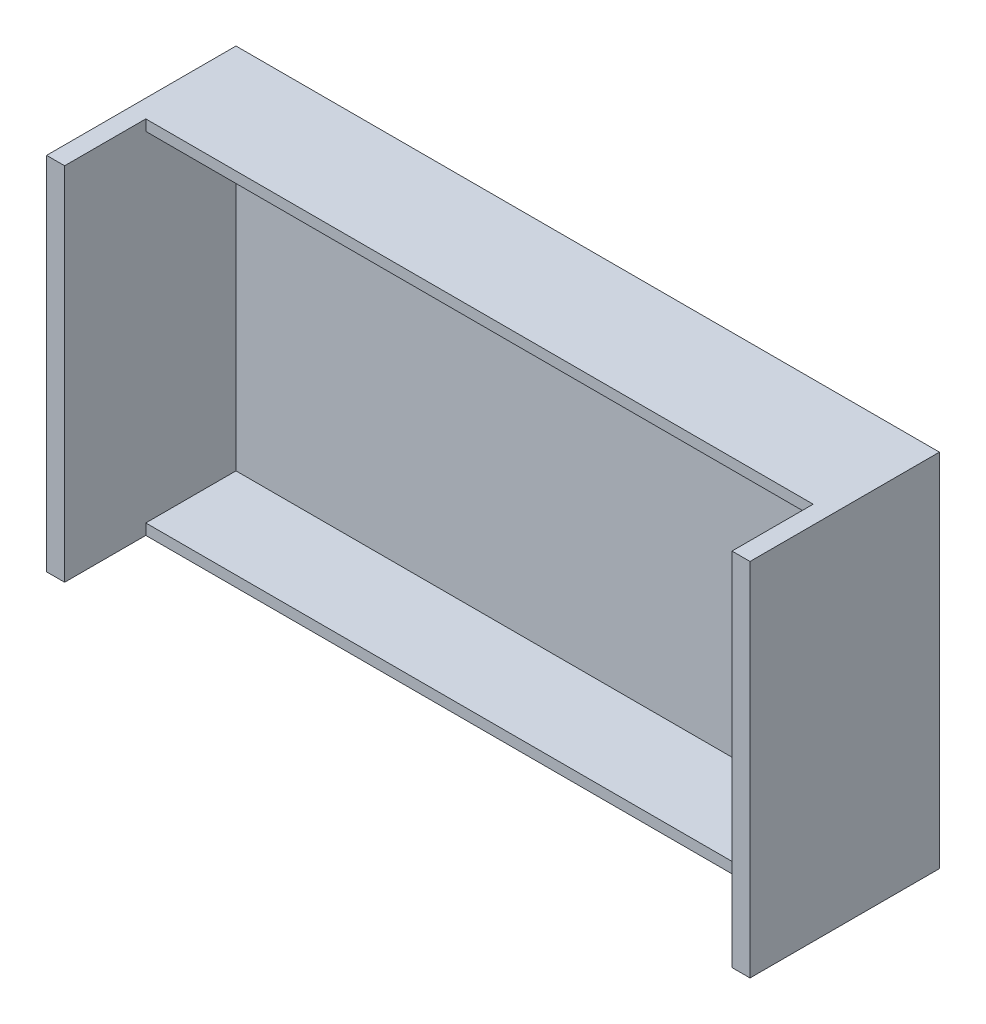
ISO-10303-21;
HEADER;
FILE_DESCRIPTION(('STEP AP214'),'2;1');
FILE_NAME('part.step','',(''),(''),'','','');
FILE_SCHEMA(('AUTOMOTIVE_DESIGN { 1 0 10303 214 1 1 1 1 }'));
ENDSEC;
DATA;
#1=APPLICATION_CONTEXT('core data for automotive mechanical design processes');
#2=APPLICATION_PROTOCOL_DEFINITION('international standard','automotive_design',2000,#1);
#3=PRODUCT_CONTEXT('',#1,'mechanical');
#4=PRODUCT('Part','Part','',(#3));
#5=PRODUCT_RELATED_PRODUCT_CATEGORY('part','',(#4));
#6=PRODUCT_DEFINITION_FORMATION('','',#4);
#7=PRODUCT_DEFINITION_CONTEXT('part definition',#1,'design');
#8=PRODUCT_DEFINITION('design','',#6,#7);
#9=PRODUCT_DEFINITION_SHAPE('','',#8);
#10=(LENGTH_UNIT() NAMED_UNIT(*) SI_UNIT(.MILLI.,.METRE.));
#11=(NAMED_UNIT(*) PLANE_ANGLE_UNIT() SI_UNIT($,.RADIAN.));
#12=(NAMED_UNIT(*) SI_UNIT($,.STERADIAN.) SOLID_ANGLE_UNIT());
#13=UNCERTAINTY_MEASURE_WITH_UNIT(LENGTH_MEASURE(1.E-05),#10,'distance_accuracy_value','');
#14=(GEOMETRIC_REPRESENTATION_CONTEXT(3) GLOBAL_UNCERTAINTY_ASSIGNED_CONTEXT((#13)) GLOBAL_UNIT_ASSIGNED_CONTEXT((#10,
#11,#12)) REPRESENTATION_CONTEXT('',''));
#15=CARTESIAN_POINT('',(0.,0.,0.));
#16=DIRECTION('',(0.,0.,1.));
#17=DIRECTION('',(1.,0.,0.));
#18=AXIS2_PLACEMENT_3D('',#15,#16,#17);
#19=CARTESIAN_POINT('',(0.,0.,5.));
#20=DIRECTION('',(0.,0.,-1.));
#21=DIRECTION('',(-1.,0.,0.));
#22=AXIS2_PLACEMENT_3D('',#19,#20,#21);
#23=PLANE('',#22);
#24=DIRECTION('',(1.,0.,0.));
#25=VECTOR('',#24,1.);
#26=CARTESIAN_POINT('',(0.,-21.2,5.));
#27=LINE('',#26,#25);
#28=CARTESIAN_POINT('',(-37.,-21.2,5.00000000000001));
#29=VERTEX_POINT('',#28);
#30=CARTESIAN_POINT('',(37.,-21.2,5.00000000000001));
#31=VERTEX_POINT('',#30);
#32=EDGE_CURVE('E243',#29,#31,#27,.T.);
#33=ORIENTED_EDGE('',*,*,#32,.F.);
#34=DIRECTION('',(0.,1.,0.));
#35=VECTOR('',#34,1.);
#36=CARTESIAN_POINT('',(-37.,0.,5.));
#37=LINE('',#36,#35);
#38=CARTESIAN_POINT('',(-37.,-58.8,5.));
#39=VERTEX_POINT('',#38);
#40=EDGE_CURVE('E176',#39,#29,#37,.T.);
#41=ORIENTED_EDGE('',*,*,#40,.F.);
#42=DIRECTION('',(-1.,0.,0.));
#43=VECTOR('',#42,1.);
#44=CARTESIAN_POINT('',(0.,-58.8,5.));
#45=LINE('',#44,#43);
#46=CARTESIAN_POINT('',(37.,-58.8,5.));
#47=VERTEX_POINT('',#46);
#48=EDGE_CURVE('E212',#47,#39,#45,.T.);
#49=ORIENTED_EDGE('',*,*,#48,.F.);
#50=DIRECTION('',(0.,-1.,0.));
#51=VECTOR('',#50,1.);
#52=CARTESIAN_POINT('',(37.,0.,5.));
#53=LINE('',#52,#51);
#54=EDGE_CURVE('E153',#31,#47,#53,.T.);
#55=ORIENTED_EDGE('',*,*,#54,.F.);
#56=EDGE_LOOP('',(#33,#41,#49,#55));
#57=FACE_BOUND('',#56,.T.);
#58=ADVANCED_FACE('F39',(#57),#23,.F.);
#59=CARTESIAN_POINT('',(-37.,-60.,24.));
#60=DIRECTION('',(-1.,0.,0.));
#61=DIRECTION('',(0.,0.,1.));
#62=AXIS2_PLACEMENT_3D('',#59,#60,#61);
#63=PLANE('',#62);
#64=DIRECTION('',(0.,0.,-1.));
#65=VECTOR('',#64,1.);
#66=CARTESIAN_POINT('',(-37.,-21.2,15.));
#67=LINE('',#66,#65);
#68=CARTESIAN_POINT('',(-37.,-21.2,15.));
#69=VERTEX_POINT('',#68);
#70=EDGE_CURVE('E246',#69,#29,#67,.T.);
#71=ORIENTED_EDGE('',*,*,#70,.F.);
#72=DIRECTION('',(0.,-1.,0.));
#73=VECTOR('',#72,1.);
#74=CARTESIAN_POINT('',(-37.,-21.2,15.));
#75=LINE('',#74,#73);
#76=CARTESIAN_POINT('',(-37.,-20.,15.));
#77=VERTEX_POINT('',#76);
#78=EDGE_CURVE('E139',#77,#69,#75,.T.);
#79=ORIENTED_EDGE('',*,*,#78,.F.);
#80=DIRECTION('',(0.,0.,-1.));
#81=VECTOR('',#80,1.);
#82=CARTESIAN_POINT('',(-37.,-20.,24.));
#83=LINE('',#82,#81);
#84=CARTESIAN_POINT('',(-37.,-20.,24.));
#85=VERTEX_POINT('',#84);
#86=EDGE_CURVE('E136',#85,#77,#83,.T.);
#87=ORIENTED_EDGE('',*,*,#86,.F.);
#88=DIRECTION('',(0.,1.,0.));
#89=VECTOR('',#88,1.);
#90=CARTESIAN_POINT('',(-37.,-60.,24.));
#91=LINE('',#90,#89);
#92=CARTESIAN_POINT('',(-37.,-60.,24.));
#93=VERTEX_POINT('',#92);
#94=EDGE_CURVE('E156',#93,#85,#91,.T.);
#95=ORIENTED_EDGE('',*,*,#94,.F.);
#96=DIRECTION('',(0.,0.,-1.));
#97=VECTOR('',#96,1.);
#98=CARTESIAN_POINT('',(-37.,-60.,24.));
#99=LINE('',#98,#97);
#100=CARTESIAN_POINT('',(-37.,-60.,15.));
#101=VERTEX_POINT('',#100);
#102=EDGE_CURVE('E173',#93,#101,#99,.T.);
#103=ORIENTED_EDGE('',*,*,#102,.T.);
#104=DIRECTION('',(0.,-1.,0.));
#105=VECTOR('',#104,1.);
#106=CARTESIAN_POINT('',(-37.,-60.,15.));
#107=LINE('',#106,#105);
#108=CARTESIAN_POINT('',(-37.,-58.8,15.));
#109=VERTEX_POINT('',#108);
#110=EDGE_CURVE('E54',#109,#101,#107,.T.);
#111=ORIENTED_EDGE('',*,*,#110,.F.);
#112=DIRECTION('',(0.,0.,-1.));
#113=VECTOR('',#112,1.);
#114=CARTESIAN_POINT('',(-37.,-58.8,15.));
#115=LINE('',#114,#113);
#116=EDGE_CURVE('E59',#109,#39,#115,.T.);
#117=ORIENTED_EDGE('',*,*,#116,.T.);
#118=ORIENTED_EDGE('',*,*,#40,.T.);
#119=EDGE_LOOP('',(#71,#79,#87,#95,#103,#111,#117,#118));
#120=FACE_BOUND('',#119,.T.);
#121=ADVANCED_FACE('F245',(#120),#63,.F.);
#122=CARTESIAN_POINT('',(37.,-60.,24.));
#123=DIRECTION('',(1.,0.,0.));
#124=DIRECTION('',(0.,0.,-1.));
#125=AXIS2_PLACEMENT_3D('',#122,#123,#124);
#126=PLANE('',#125);
#127=DIRECTION('',(0.,0.,-1.));
#128=VECTOR('',#127,1.);
#129=CARTESIAN_POINT('',(37.,-21.2,15.));
#130=LINE('',#129,#128);
#131=CARTESIAN_POINT('',(37.,-21.2,15.));
#132=VERTEX_POINT('',#131);
#133=EDGE_CURVE('E240',#132,#31,#130,.T.);
#134=ORIENTED_EDGE('',*,*,#133,.T.);
#135=ORIENTED_EDGE('',*,*,#54,.T.);
#136=DIRECTION('',(0.,0.,-1.));
#137=VECTOR('',#136,1.);
#138=CARTESIAN_POINT('',(37.,-58.8,15.));
#139=LINE('',#138,#137);
#140=CARTESIAN_POINT('',(37.,-58.8,15.));
#141=VERTEX_POINT('',#140);
#142=EDGE_CURVE('E216',#141,#47,#139,.T.);
#143=ORIENTED_EDGE('',*,*,#142,.F.);
#144=DIRECTION('',(0.,1.,0.));
#145=VECTOR('',#144,1.);
#146=CARTESIAN_POINT('',(37.,-60.,15.));
#147=LINE('',#146,#145);
#148=CARTESIAN_POINT('',(37.,-60.,15.));
#149=VERTEX_POINT('',#148);
#150=EDGE_CURVE('E228',#149,#141,#147,.T.);
#151=ORIENTED_EDGE('',*,*,#150,.F.);
#152=DIRECTION('',(0.,0.,-1.));
#153=VECTOR('',#152,1.);
#154=CARTESIAN_POINT('',(37.,-60.,24.));
#155=LINE('',#154,#153);
#156=CARTESIAN_POINT('',(37.,-60.,24.));
#157=VERTEX_POINT('',#156);
#158=EDGE_CURVE('E154',#157,#149,#155,.T.);
#159=ORIENTED_EDGE('',*,*,#158,.F.);
#160=DIRECTION('',(0.,-1.,0.));
#161=VECTOR('',#160,1.);
#162=CARTESIAN_POINT('',(37.,-60.,24.));
#163=LINE('',#162,#161);
#164=CARTESIAN_POINT('',(37.,-20.,24.));
#165=VERTEX_POINT('',#164);
#166=EDGE_CURVE('E152',#165,#157,#163,.T.);
#167=ORIENTED_EDGE('',*,*,#166,.F.);
#168=DIRECTION('',(0.,0.,-1.));
#169=VECTOR('',#168,1.);
#170=CARTESIAN_POINT('',(37.,-20.,24.));
#171=LINE('',#170,#169);
#172=CARTESIAN_POINT('',(37.,-20.,15.));
#173=VERTEX_POINT('',#172);
#174=EDGE_CURVE('E133',#165,#173,#171,.T.);
#175=ORIENTED_EDGE('',*,*,#174,.T.);
#176=DIRECTION('',(0.,1.,0.));
#177=VECTOR('',#176,1.);
#178=CARTESIAN_POINT('',(37.,-21.2,15.));
#179=LINE('',#178,#177);
#180=EDGE_CURVE('E140',#132,#173,#179,.T.);
#181=ORIENTED_EDGE('',*,*,#180,.F.);
#182=EDGE_LOOP('',(#134,#135,#143,#151,#159,#167,#175,#181));
#183=FACE_BOUND('',#182,.T.);
#184=ADVANCED_FACE('F150',(#183),#126,.F.);
#185=CARTESIAN_POINT('',(39.,-60.,5.));
#186=DIRECTION('',(-1.,0.,0.));
#187=DIRECTION('',(0.,0.,1.));
#188=AXIS2_PLACEMENT_3D('',#185,#186,#187);
#189=PLANE('',#188);
#190=DIRECTION('',(0.,1.,0.));
#191=VECTOR('',#190,1.);
#192=CARTESIAN_POINT('',(39.,-60.,3.));
#193=LINE('',#192,#191);
#194=CARTESIAN_POINT('',(39.,-60.,3.));
#195=VERTEX_POINT('',#194);
#196=CARTESIAN_POINT('',(39.,-20.,3.));
#197=VERTEX_POINT('',#196);
#198=EDGE_CURVE('E178',#195,#197,#193,.T.);
#199=ORIENTED_EDGE('',*,*,#198,.T.);
#200=DIRECTION('',(0.,0.,-1.));
#201=VECTOR('',#200,1.);
#202=CARTESIAN_POINT('',(39.,-20.,5.));
#203=LINE('',#202,#201);
#204=CARTESIAN_POINT('',(39.,-20.,24.));
#205=VERTEX_POINT('',#204);
#206=EDGE_CURVE('E11',#205,#197,#203,.T.);
#207=ORIENTED_EDGE('',*,*,#206,.F.);
#208=DIRECTION('',(0.,1.,0.));
#209=VECTOR('',#208,1.);
#210=CARTESIAN_POINT('',(39.,-60.,24.));
#211=LINE('',#210,#209);
#212=CARTESIAN_POINT('',(39.,-60.,24.));
#213=VERTEX_POINT('',#212);
#214=EDGE_CURVE('E209',#213,#205,#211,.T.);
#215=ORIENTED_EDGE('',*,*,#214,.F.);
#216=DIRECTION('',(0.,0.,-1.));
#217=VECTOR('',#216,1.);
#218=CARTESIAN_POINT('',(39.,-60.,5.));
#219=LINE('',#218,#217);
#220=EDGE_CURVE('E187',#213,#195,#219,.T.);
#221=ORIENTED_EDGE('',*,*,#220,.T.);
#222=EDGE_LOOP('',(#199,#207,#215,#221));
#223=FACE_BOUND('',#222,.T.);
#224=ADVANCED_FACE('F41',(#223),#189,.F.);
#225=CARTESIAN_POINT('',(-39.,-20.,5.));
#226=DIRECTION('',(0.,-1.,0.));
#227=DIRECTION('',(0.,0.,-1.));
#228=AXIS2_PLACEMENT_3D('',#225,#226,#227);
#229=PLANE('',#228);
#230=DIRECTION('',(-1.,0.,0.));
#231=VECTOR('',#230,1.);
#232=CARTESIAN_POINT('',(-37.,-20.,15.));
#233=LINE('',#232,#231);
#234=EDGE_CURVE('E128',#173,#77,#233,.T.);
#235=ORIENTED_EDGE('',*,*,#234,.F.);
#236=ORIENTED_EDGE('',*,*,#174,.F.);
#237=DIRECTION('',(-1.,0.,0.));
#238=VECTOR('',#237,1.);
#239=CARTESIAN_POINT('',(37.,-20.,24.));
#240=LINE('',#239,#238);
#241=EDGE_CURVE('E211',#205,#165,#240,.T.);
#242=ORIENTED_EDGE('',*,*,#241,.F.);
#243=ORIENTED_EDGE('',*,*,#206,.T.);
#244=DIRECTION('',(-1.,0.,0.));
#245=VECTOR('',#244,1.);
#246=CARTESIAN_POINT('',(-39.,-20.,3.));
#247=LINE('',#246,#245);
#248=CARTESIAN_POINT('',(-39.,-20.,3.));
#249=VERTEX_POINT('',#248);
#250=EDGE_CURVE('E181',#197,#249,#247,.T.);
#251=ORIENTED_EDGE('',*,*,#250,.T.);
#252=DIRECTION('',(0.,0.,-1.));
#253=VECTOR('',#252,1.);
#254=CARTESIAN_POINT('',(-39.,-20.,5.));
#255=LINE('',#254,#253);
#256=CARTESIAN_POINT('',(-39.,-20.,24.));
#257=VERTEX_POINT('',#256);
#258=EDGE_CURVE('E47',#257,#249,#255,.T.);
#259=ORIENTED_EDGE('',*,*,#258,.F.);
#260=DIRECTION('',(-1.,0.,0.));
#261=VECTOR('',#260,1.);
#262=CARTESIAN_POINT('',(-39.,-20.,24.));
#263=LINE('',#262,#261);
#264=EDGE_CURVE('E165',#85,#257,#263,.T.);
#265=ORIENTED_EDGE('',*,*,#264,.F.);
#266=ORIENTED_EDGE('',*,*,#86,.T.);
#267=EDGE_LOOP('',(#235,#236,#242,#243,#251,#259,#265,#266));
#268=FACE_BOUND('',#267,.T.);
#269=ADVANCED_FACE('F130',(#268),#229,.F.);
#270=CARTESIAN_POINT('',(-39.,-60.,5.));
#271=DIRECTION('',(1.,0.,0.));
#272=DIRECTION('',(0.,0.,-1.));
#273=AXIS2_PLACEMENT_3D('',#270,#271,#272);
#274=PLANE('',#273);
#275=DIRECTION('',(0.,-1.,0.));
#276=VECTOR('',#275,1.);
#277=CARTESIAN_POINT('',(-39.,-60.,3.));
#278=LINE('',#277,#276);
#279=CARTESIAN_POINT('',(-39.,-60.,3.));
#280=VERTEX_POINT('',#279);
#281=EDGE_CURVE('E183',#249,#280,#278,.T.);
#282=ORIENTED_EDGE('',*,*,#281,.T.);
#283=DIRECTION('',(0.,0.,-1.));
#284=VECTOR('',#283,1.);
#285=CARTESIAN_POINT('',(-39.,-60.,5.));
#286=LINE('',#285,#284);
#287=CARTESIAN_POINT('',(-39.,-60.,24.));
#288=VERTEX_POINT('',#287);
#289=EDGE_CURVE('E190',#288,#280,#286,.T.);
#290=ORIENTED_EDGE('',*,*,#289,.F.);
#291=DIRECTION('',(0.,-1.,0.));
#292=VECTOR('',#291,1.);
#293=CARTESIAN_POINT('',(-39.,-60.,24.));
#294=LINE('',#293,#292);
#295=EDGE_CURVE('E168',#257,#288,#294,.T.);
#296=ORIENTED_EDGE('',*,*,#295,.F.);
#297=ORIENTED_EDGE('',*,*,#258,.T.);
#298=EDGE_LOOP('',(#282,#290,#296,#297));
#299=FACE_BOUND('',#298,.T.);
#300=ADVANCED_FACE('F196',(#299),#274,.F.);
#301=CARTESIAN_POINT('',(-39.,-60.,5.));
#302=DIRECTION('',(0.,1.,0.));
#303=DIRECTION('',(0.,0.,1.));
#304=AXIS2_PLACEMENT_3D('',#301,#302,#303);
#305=PLANE('',#304);
#306=DIRECTION('',(1.,0.,0.));
#307=VECTOR('',#306,1.);
#308=CARTESIAN_POINT('',(-39.,-60.,3.));
#309=LINE('',#308,#307);
#310=EDGE_CURVE('E185',#280,#195,#309,.T.);
#311=ORIENTED_EDGE('',*,*,#310,.T.);
#312=ORIENTED_EDGE('',*,*,#220,.F.);
#313=DIRECTION('',(1.,0.,0.));
#314=VECTOR('',#313,1.);
#315=CARTESIAN_POINT('',(37.,-60.,24.));
#316=LINE('',#315,#314);
#317=EDGE_CURVE('E159',#157,#213,#316,.T.);
#318=ORIENTED_EDGE('',*,*,#317,.F.);
#319=ORIENTED_EDGE('',*,*,#158,.T.);
#320=DIRECTION('',(1.,0.,0.));
#321=VECTOR('',#320,1.);
#322=CARTESIAN_POINT('',(-37.,-60.,15.));
#323=LINE('',#322,#321);
#324=EDGE_CURVE('E224',#101,#149,#323,.T.);
#325=ORIENTED_EDGE('',*,*,#324,.F.);
#326=ORIENTED_EDGE('',*,*,#102,.F.);
#327=DIRECTION('',(1.,0.,0.));
#328=VECTOR('',#327,1.);
#329=CARTESIAN_POINT('',(-39.,-60.,24.));
#330=LINE('',#329,#328);
#331=EDGE_CURVE('E171',#288,#93,#330,.T.);
#332=ORIENTED_EDGE('',*,*,#331,.F.);
#333=ORIENTED_EDGE('',*,*,#289,.T.);
#334=EDGE_LOOP('',(#311,#312,#318,#319,#325,#326,#332,#333));
#335=FACE_BOUND('',#334,.T.);
#336=ADVANCED_FACE('F202',(#335),#305,.F.);
#337=CARTESIAN_POINT('',(0.,0.,3.));
#338=DIRECTION('',(0.,0.,-1.));
#339=DIRECTION('',(-1.,0.,0.));
#340=AXIS2_PLACEMENT_3D('',#337,#338,#339);
#341=PLANE('',#340);
#342=ORIENTED_EDGE('',*,*,#281,.F.);
#343=ORIENTED_EDGE('',*,*,#250,.F.);
#344=ORIENTED_EDGE('',*,*,#198,.F.);
#345=ORIENTED_EDGE('',*,*,#310,.F.);
#346=EDGE_LOOP('',(#342,#343,#344,#345));
#347=FACE_BOUND('',#346,.T.);
#348=ADVANCED_FACE('F199',(#347),#341,.T.);
#349=CARTESIAN_POINT('',(0.,0.,24.));
#350=DIRECTION('',(0.,0.,-1.));
#351=DIRECTION('',(-1.,0.,0.));
#352=AXIS2_PLACEMENT_3D('',#349,#350,#351);
#353=PLANE('',#352);
#354=ORIENTED_EDGE('',*,*,#94,.T.);
#355=ORIENTED_EDGE('',*,*,#264,.T.);
#356=ORIENTED_EDGE('',*,*,#295,.T.);
#357=ORIENTED_EDGE('',*,*,#331,.T.);
#358=EDGE_LOOP('',(#354,#355,#356,#357));
#359=FACE_BOUND('',#358,.T.);
#360=ADVANCED_FACE('F273',(#359),#353,.F.);
#361=CARTESIAN_POINT('',(0.,0.,24.));
#362=DIRECTION('',(0.,0.,-1.));
#363=DIRECTION('',(-1.,0.,0.));
#364=AXIS2_PLACEMENT_3D('',#361,#362,#363);
#365=PLANE('',#364);
#366=ORIENTED_EDGE('',*,*,#214,.T.);
#367=ORIENTED_EDGE('',*,*,#241,.T.);
#368=ORIENTED_EDGE('',*,*,#166,.T.);
#369=ORIENTED_EDGE('',*,*,#317,.T.);
#370=EDGE_LOOP('',(#366,#367,#368,#369));
#371=FACE_BOUND('',#370,.T.);
#372=ADVANCED_FACE('F220',(#371),#365,.F.);
#373=CARTESIAN_POINT('',(-37.,-58.8,15.));
#374=DIRECTION('',(0.,-1.,0.));
#375=DIRECTION('',(0.,0.,-1.));
#376=AXIS2_PLACEMENT_3D('',#373,#374,#375);
#377=PLANE('',#376);
#378=ORIENTED_EDGE('',*,*,#142,.T.);
#379=ORIENTED_EDGE('',*,*,#48,.T.);
#380=ORIENTED_EDGE('',*,*,#116,.F.);
#381=DIRECTION('',(-1.,0.,0.));
#382=VECTOR('',#381,1.);
#383=CARTESIAN_POINT('',(-37.,-58.8,15.));
#384=LINE('',#383,#382);
#385=EDGE_CURVE('E231',#141,#109,#384,.T.);
#386=ORIENTED_EDGE('',*,*,#385,.F.);
#387=EDGE_LOOP('',(#378,#379,#380,#386));
#388=FACE_BOUND('',#387,.T.);
#389=ADVANCED_FACE('F237',(#388),#377,.F.);
#390=CARTESIAN_POINT('',(0.,0.,15.));
#391=DIRECTION('',(0.,0.,-1.));
#392=DIRECTION('',(-1.,0.,0.));
#393=AXIS2_PLACEMENT_3D('',#390,#391,#392);
#394=PLANE('',#393);
#395=ORIENTED_EDGE('',*,*,#150,.T.);
#396=ORIENTED_EDGE('',*,*,#385,.T.);
#397=ORIENTED_EDGE('',*,*,#110,.T.);
#398=ORIENTED_EDGE('',*,*,#324,.T.);
#399=EDGE_LOOP('',(#395,#396,#397,#398));
#400=FACE_BOUND('',#399,.T.);
#401=ADVANCED_FACE('F227',(#400),#394,.F.);
#402=CARTESIAN_POINT('',(-37.,-21.2,15.));
#403=DIRECTION('',(0.,1.,0.));
#404=DIRECTION('',(0.,0.,1.));
#405=AXIS2_PLACEMENT_3D('',#402,#403,#404);
#406=PLANE('',#405);
#407=ORIENTED_EDGE('',*,*,#70,.T.);
#408=ORIENTED_EDGE('',*,*,#32,.T.);
#409=ORIENTED_EDGE('',*,*,#133,.F.);
#410=DIRECTION('',(1.,0.,0.));
#411=VECTOR('',#410,1.);
#412=CARTESIAN_POINT('',(-37.,-21.2,15.));
#413=LINE('',#412,#411);
#414=EDGE_CURVE('E145',#69,#132,#413,.T.);
#415=ORIENTED_EDGE('',*,*,#414,.F.);
#416=EDGE_LOOP('',(#407,#408,#409,#415));
#417=FACE_BOUND('',#416,.T.);
#418=ADVANCED_FACE('F254',(#417),#406,.F.);
#419=CARTESIAN_POINT('',(0.,0.,15.));
#420=DIRECTION('',(0.,0.,-1.));
#421=DIRECTION('',(-1.,0.,0.));
#422=AXIS2_PLACEMENT_3D('',#419,#420,#421);
#423=PLANE('',#422);
#424=ORIENTED_EDGE('',*,*,#180,.T.);
#425=ORIENTED_EDGE('',*,*,#234,.T.);
#426=ORIENTED_EDGE('',*,*,#78,.T.);
#427=ORIENTED_EDGE('',*,*,#414,.T.);
#428=EDGE_LOOP('',(#424,#425,#426,#427));
#429=FACE_BOUND('',#428,.T.);
#430=ADVANCED_FACE('F143',(#429),#423,.F.);
#431=CLOSED_SHELL('',(#58,#121,#184,#224,#269,#300,#336,#348,#360,#372,#389,#401,#418,#430));
#432=MANIFOLD_SOLID_BREP('B2',#431);
#433=ADVANCED_BREP_SHAPE_REPRESENTATION('',(#18,#432),#14);
#434=SHAPE_DEFINITION_REPRESENTATION(#9,#433);
ENDSEC;
END-ISO-10303-21;
